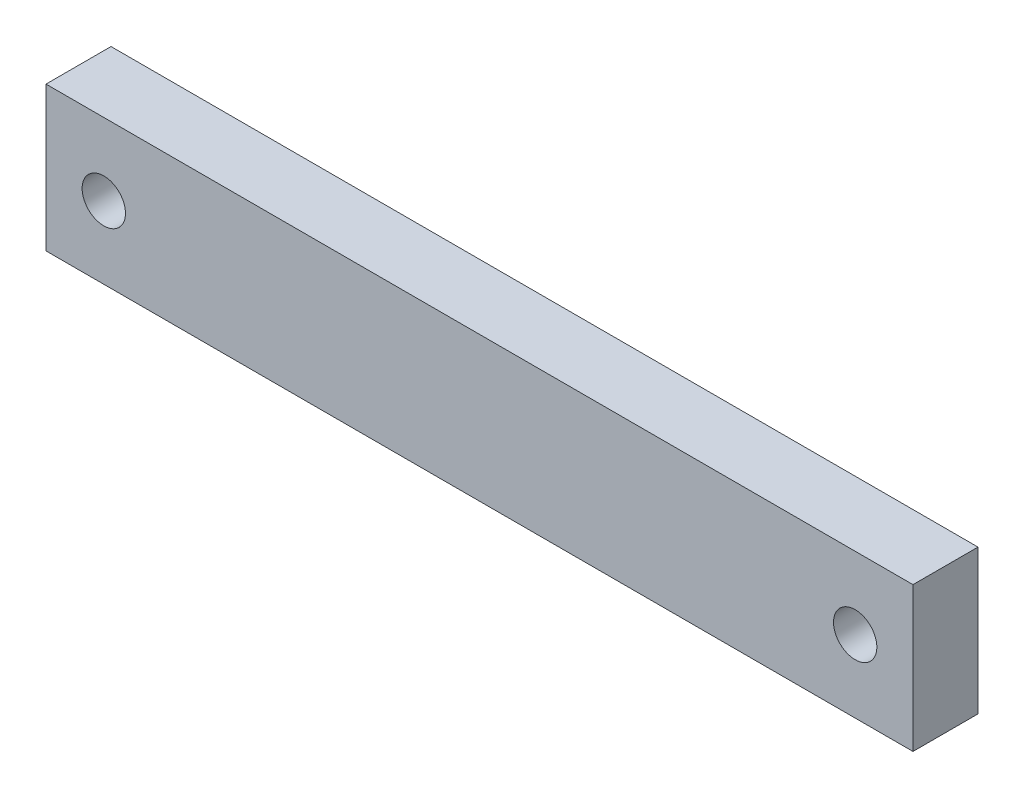
ISO-10303-21;
HEADER;
FILE_DESCRIPTION(('STEP AP214'),'2;1');
FILE_NAME('part.step','',(''),(''),'','','');
FILE_SCHEMA(('AUTOMOTIVE_DESIGN { 1 0 10303 214 1 1 1 1 }'));
ENDSEC;
DATA;
#1=APPLICATION_CONTEXT('core data for automotive mechanical design processes');
#2=APPLICATION_PROTOCOL_DEFINITION('international standard','automotive_design',2000,#1);
#3=PRODUCT_CONTEXT('',#1,'mechanical');
#4=PRODUCT('Part','Part','',(#3));
#5=PRODUCT_RELATED_PRODUCT_CATEGORY('part','',(#4));
#6=PRODUCT_DEFINITION_FORMATION('','',#4);
#7=PRODUCT_DEFINITION_CONTEXT('part definition',#1,'design');
#8=PRODUCT_DEFINITION('design','',#6,#7);
#9=PRODUCT_DEFINITION_SHAPE('','',#8);
#10=(LENGTH_UNIT() NAMED_UNIT(*) SI_UNIT(.MILLI.,.METRE.));
#11=(NAMED_UNIT(*) PLANE_ANGLE_UNIT() SI_UNIT($,.RADIAN.));
#12=(NAMED_UNIT(*) SI_UNIT($,.STERADIAN.) SOLID_ANGLE_UNIT());
#13=UNCERTAINTY_MEASURE_WITH_UNIT(LENGTH_MEASURE(1.E-05),#10,'distance_accuracy_value','');
#14=(GEOMETRIC_REPRESENTATION_CONTEXT(3) GLOBAL_UNCERTAINTY_ASSIGNED_CONTEXT((#13)) GLOBAL_UNIT_ASSIGNED_CONTEXT((#10,
#11,#12)) REPRESENTATION_CONTEXT('',''));
#15=CARTESIAN_POINT('',(0.,0.,0.));
#16=DIRECTION('',(0.,0.,1.));
#17=DIRECTION('',(1.,0.,0.));
#18=AXIS2_PLACEMENT_3D('',#15,#16,#17);
#19=CARTESIAN_POINT('',(0.,0.,4.5));
#20=DIRECTION('',(0.,0.,1.));
#21=DIRECTION('',(1.,0.,0.));
#22=AXIS2_PLACEMENT_3D('',#19,#20,#21);
#23=PLANE('',#22);
#24=CARTESIAN_POINT('',(-26.,0.,4.5));
#25=DIRECTION('',(0.,0.,1.));
#26=DIRECTION('',(1.,0.,0.));
#27=AXIS2_PLACEMENT_3D('',#24,#25,#26);
#28=CIRCLE('',#27,1.5);
#29=CARTESIAN_POINT('',(-24.5,0.,4.5));
#30=VERTEX_POINT('',#29);
#31=EDGE_CURVE('E118',#30,#30,#28,.T.);
#32=ORIENTED_EDGE('',*,*,#31,.F.);
#33=EDGE_LOOP('',(#32));
#34=FACE_BOUND('',#33,.T.);
#35=DIRECTION('',(0.,-1.,0.));
#36=VECTOR('',#35,1.);
#37=CARTESIAN_POINT('',(-30.,-5.00000000000001,4.5));
#38=LINE('',#37,#36);
#39=CARTESIAN_POINT('',(-30.,4.99999999999999,4.5));
#40=VERTEX_POINT('',#39);
#41=CARTESIAN_POINT('',(-30.,-5.00000000000001,4.5));
#42=VERTEX_POINT('',#41);
#43=EDGE_CURVE('E98',#40,#42,#38,.T.);
#44=ORIENTED_EDGE('',*,*,#43,.T.);
#45=DIRECTION('',(1.,0.,0.));
#46=VECTOR('',#45,1.);
#47=CARTESIAN_POINT('',(30.,-5.,4.5));
#48=LINE('',#47,#46);
#49=CARTESIAN_POINT('',(30.,-5.,4.5));
#50=VERTEX_POINT('',#49);
#51=EDGE_CURVE('E93',#42,#50,#48,.T.);
#52=ORIENTED_EDGE('',*,*,#51,.T.);
#53=DIRECTION('',(0.,1.,0.));
#54=VECTOR('',#53,1.);
#55=CARTESIAN_POINT('',(30.,-5.,4.5));
#56=LINE('',#55,#54);
#57=CARTESIAN_POINT('',(30.,5.,4.5));
#58=VERTEX_POINT('',#57);
#59=EDGE_CURVE('E96',#50,#58,#56,.T.);
#60=ORIENTED_EDGE('',*,*,#59,.T.);
#61=DIRECTION('',(-1.,0.,0.));
#62=VECTOR('',#61,1.);
#63=CARTESIAN_POINT('',(30.,5.,4.5));
#64=LINE('',#63,#62);
#65=EDGE_CURVE('E63',#58,#40,#64,.T.);
#66=ORIENTED_EDGE('',*,*,#65,.T.);
#67=EDGE_LOOP('',(#44,#52,#60,#66));
#68=FACE_BOUND('',#67,.T.);
#69=CARTESIAN_POINT('',(26.,0.,4.5));
#70=DIRECTION('',(0.,0.,1.));
#71=DIRECTION('',(1.,0.,0.));
#72=AXIS2_PLACEMENT_3D('',#69,#70,#71);
#73=CIRCLE('',#72,1.5);
#74=CARTESIAN_POINT('',(27.5,0.,4.5));
#75=VERTEX_POINT('',#74);
#76=EDGE_CURVE('E140',#75,#75,#73,.T.);
#77=ORIENTED_EDGE('',*,*,#76,.F.);
#78=EDGE_LOOP('',(#77));
#79=FACE_BOUND('',#78,.T.);
#80=ADVANCED_FACE('F45',(#34,#68,#79),#23,.T.);
#81=CARTESIAN_POINT('',(0.,0.,0.));
#82=DIRECTION('',(0.,0.,1.));
#83=DIRECTION('',(1.,0.,0.));
#84=AXIS2_PLACEMENT_3D('',#81,#82,#83);
#85=PLANE('',#84);
#86=DIRECTION('',(0.,-1.,0.));
#87=VECTOR('',#86,1.);
#88=CARTESIAN_POINT('',(-30.,-5.00000000000001,0.));
#89=LINE('',#88,#87);
#90=CARTESIAN_POINT('',(-30.,4.99999999999999,0.));
#91=VERTEX_POINT('',#90);
#92=CARTESIAN_POINT('',(-30.,-5.00000000000001,0.));
#93=VERTEX_POINT('',#92);
#94=EDGE_CURVE('E114',#91,#93,#89,.T.);
#95=ORIENTED_EDGE('',*,*,#94,.F.);
#96=DIRECTION('',(-1.,0.,0.));
#97=VECTOR('',#96,1.);
#98=CARTESIAN_POINT('',(30.,5.,0.));
#99=LINE('',#98,#97);
#100=CARTESIAN_POINT('',(30.,5.,0.));
#101=VERTEX_POINT('',#100);
#102=EDGE_CURVE('E86',#101,#91,#99,.T.);
#103=ORIENTED_EDGE('',*,*,#102,.F.);
#104=DIRECTION('',(0.,1.,0.));
#105=VECTOR('',#104,1.);
#106=CARTESIAN_POINT('',(30.,-5.,0.));
#107=LINE('',#106,#105);
#108=CARTESIAN_POINT('',(30.,-5.,0.));
#109=VERTEX_POINT('',#108);
#110=EDGE_CURVE('E80',#109,#101,#107,.T.);
#111=ORIENTED_EDGE('',*,*,#110,.F.);
#112=DIRECTION('',(1.,0.,0.));
#113=VECTOR('',#112,1.);
#114=CARTESIAN_POINT('',(30.,-5.,0.));
#115=LINE('',#114,#113);
#116=EDGE_CURVE('E103',#93,#109,#115,.T.);
#117=ORIENTED_EDGE('',*,*,#116,.F.);
#118=EDGE_LOOP('',(#95,#103,#111,#117));
#119=FACE_BOUND('',#118,.T.);
#120=CARTESIAN_POINT('',(-26.,0.,0.));
#121=DIRECTION('',(0.,0.,1.));
#122=DIRECTION('',(1.,0.,0.));
#123=AXIS2_PLACEMENT_3D('',#120,#121,#122);
#124=CIRCLE('',#123,1.5);
#125=CARTESIAN_POINT('',(-24.5,0.,0.));
#126=VERTEX_POINT('',#125);
#127=EDGE_CURVE('E136',#126,#126,#124,.T.);
#128=ORIENTED_EDGE('',*,*,#127,.T.);
#129=EDGE_LOOP('',(#128));
#130=FACE_BOUND('',#129,.T.);
#131=CARTESIAN_POINT('',(26.,0.,0.));
#132=DIRECTION('',(0.,0.,1.));
#133=DIRECTION('',(1.,0.,0.));
#134=AXIS2_PLACEMENT_3D('',#131,#132,#133);
#135=CIRCLE('',#134,1.5);
#136=CARTESIAN_POINT('',(27.5,0.,0.));
#137=VERTEX_POINT('',#136);
#138=EDGE_CURVE('E144',#137,#137,#135,.T.);
#139=ORIENTED_EDGE('',*,*,#138,.T.);
#140=EDGE_LOOP('',(#139));
#141=FACE_BOUND('',#140,.T.);
#142=ADVANCED_FACE('F131',(#119,#130,#141),#85,.F.);
#143=CARTESIAN_POINT('',(-30.,-5.00000000000001,4.5));
#144=DIRECTION('',(1.,0.,0.));
#145=DIRECTION('',(0.,0.,-1.));
#146=AXIS2_PLACEMENT_3D('',#143,#144,#145);
#147=PLANE('',#146);
#148=ORIENTED_EDGE('',*,*,#94,.T.);
#149=DIRECTION('',(0.,0.,-1.));
#150=VECTOR('',#149,1.);
#151=CARTESIAN_POINT('',(-30.,-5.00000000000001,4.5));
#152=LINE('',#151,#150);
#153=EDGE_CURVE('E11',#42,#93,#152,.T.);
#154=ORIENTED_EDGE('',*,*,#153,.F.);
#155=ORIENTED_EDGE('',*,*,#43,.F.);
#156=DIRECTION('',(0.,0.,-1.));
#157=VECTOR('',#156,1.);
#158=CARTESIAN_POINT('',(-30.,4.99999999999999,4.5));
#159=LINE('',#158,#157);
#160=EDGE_CURVE('E110',#40,#91,#159,.T.);
#161=ORIENTED_EDGE('',*,*,#160,.T.);
#162=EDGE_LOOP('',(#148,#154,#155,#161));
#163=FACE_BOUND('',#162,.T.);
#164=ADVANCED_FACE('F47',(#163),#147,.F.);
#165=CARTESIAN_POINT('',(30.,-5.,4.5));
#166=DIRECTION('',(0.,1.,0.));
#167=DIRECTION('',(-1.,0.,0.));
#168=AXIS2_PLACEMENT_3D('',#165,#166,#167);
#169=PLANE('',#168);
#170=ORIENTED_EDGE('',*,*,#116,.T.);
#171=DIRECTION('',(0.,0.,-1.));
#172=VECTOR('',#171,1.);
#173=CARTESIAN_POINT('',(30.,-5.,4.5));
#174=LINE('',#173,#172);
#175=EDGE_CURVE('E55',#50,#109,#174,.T.);
#176=ORIENTED_EDGE('',*,*,#175,.F.);
#177=ORIENTED_EDGE('',*,*,#51,.F.);
#178=ORIENTED_EDGE('',*,*,#153,.T.);
#179=EDGE_LOOP('',(#170,#176,#177,#178));
#180=FACE_BOUND('',#179,.T.);
#181=ADVANCED_FACE('F102',(#180),#169,.F.);
#182=CARTESIAN_POINT('',(30.,-5.,4.5));
#183=DIRECTION('',(-1.,0.,0.));
#184=DIRECTION('',(0.,0.,1.));
#185=AXIS2_PLACEMENT_3D('',#182,#183,#184);
#186=PLANE('',#185);
#187=ORIENTED_EDGE('',*,*,#110,.T.);
#188=DIRECTION('',(0.,0.,-1.));
#189=VECTOR('',#188,1.);
#190=CARTESIAN_POINT('',(30.,5.,4.5));
#191=LINE('',#190,#189);
#192=EDGE_CURVE('E105',#58,#101,#191,.T.);
#193=ORIENTED_EDGE('',*,*,#192,.F.);
#194=ORIENTED_EDGE('',*,*,#59,.F.);
#195=ORIENTED_EDGE('',*,*,#175,.T.);
#196=EDGE_LOOP('',(#187,#193,#194,#195));
#197=FACE_BOUND('',#196,.T.);
#198=ADVANCED_FACE('F106',(#197),#186,.F.);
#199=CARTESIAN_POINT('',(30.,5.,4.5));
#200=DIRECTION('',(0.,-1.,0.));
#201=DIRECTION('',(1.,0.,0.));
#202=AXIS2_PLACEMENT_3D('',#199,#200,#201);
#203=PLANE('',#202);
#204=ORIENTED_EDGE('',*,*,#102,.T.);
#205=ORIENTED_EDGE('',*,*,#160,.F.);
#206=ORIENTED_EDGE('',*,*,#65,.F.);
#207=ORIENTED_EDGE('',*,*,#192,.T.);
#208=EDGE_LOOP('',(#204,#205,#206,#207));
#209=FACE_BOUND('',#208,.T.);
#210=ADVANCED_FACE('F128',(#209),#203,.F.);
#211=CARTESIAN_POINT('',(-26.,0.,4.5));
#212=DIRECTION('',(0.,0.,-1.));
#213=DIRECTION('',(-1.,0.,0.));
#214=AXIS2_PLACEMENT_3D('',#211,#212,#213);
#215=CYLINDRICAL_SURFACE('',#214,1.5);
#216=ORIENTED_EDGE('',*,*,#31,.T.);
#217=EDGE_LOOP('',(#216));
#218=FACE_BOUND('',#217,.T.);
#219=ORIENTED_EDGE('',*,*,#127,.F.);
#220=EDGE_LOOP('',(#219));
#221=FACE_BOUND('',#220,.T.);
#222=ADVANCED_FACE('F163',(#218,#221),#215,.F.);
#223=CARTESIAN_POINT('',(26.,0.,4.5));
#224=DIRECTION('',(0.,0.,-1.));
#225=DIRECTION('',(-1.,0.,0.));
#226=AXIS2_PLACEMENT_3D('',#223,#224,#225);
#227=CYLINDRICAL_SURFACE('',#226,1.5);
#228=ORIENTED_EDGE('',*,*,#76,.T.);
#229=EDGE_LOOP('',(#228));
#230=FACE_BOUND('',#229,.T.);
#231=ORIENTED_EDGE('',*,*,#138,.F.);
#232=EDGE_LOOP('',(#231));
#233=FACE_BOUND('',#232,.T.);
#234=ADVANCED_FACE('F152',(#230,#233),#227,.F.);
#235=CLOSED_SHELL('',(#80,#142,#164,#181,#198,#210,#222,#234));
#236=MANIFOLD_SOLID_BREP('B2',#235);
#237=ADVANCED_BREP_SHAPE_REPRESENTATION('',(#18,#236),#14);
#238=SHAPE_DEFINITION_REPRESENTATION(#9,#237);
ENDSEC;
END-ISO-10303-21;
